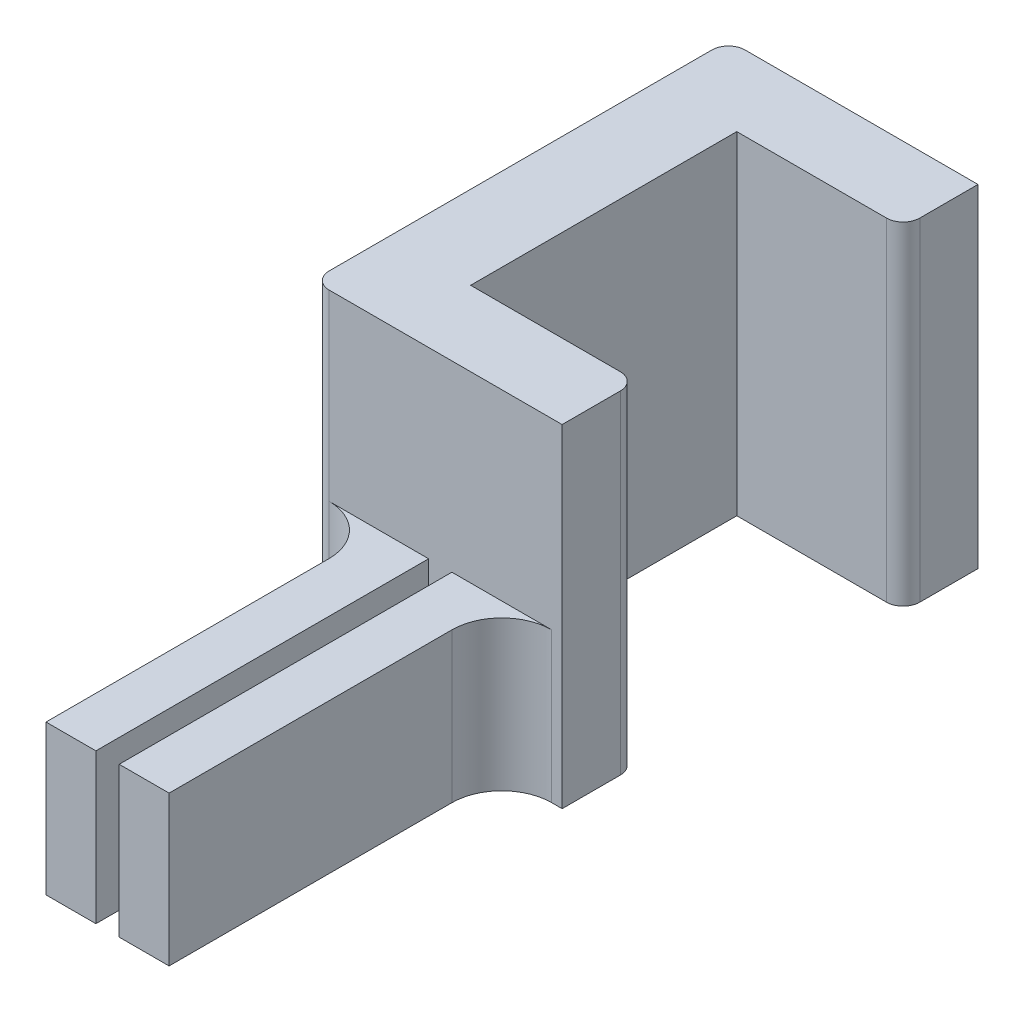
ISO-10303-21;
HEADER;
FILE_DESCRIPTION(('STEP AP214'),'2;1');
FILE_NAME('part.step','',(''),(''),'','','');
FILE_SCHEMA(('AUTOMOTIVE_DESIGN { 1 0 10303 214 1 1 1 1 }'));
ENDSEC;
DATA;
#1=APPLICATION_CONTEXT('core data for automotive mechanical design processes');
#2=APPLICATION_PROTOCOL_DEFINITION('international standard','automotive_design',2000,#1);
#3=PRODUCT_CONTEXT('',#1,'mechanical');
#4=PRODUCT('Part','Part','',(#3));
#5=PRODUCT_RELATED_PRODUCT_CATEGORY('part','',(#4));
#6=PRODUCT_DEFINITION_FORMATION('','',#4);
#7=PRODUCT_DEFINITION_CONTEXT('part definition',#1,'design');
#8=PRODUCT_DEFINITION('design','',#6,#7);
#9=PRODUCT_DEFINITION_SHAPE('','',#8);
#10=(LENGTH_UNIT() NAMED_UNIT(*) SI_UNIT(.MILLI.,.METRE.));
#11=(NAMED_UNIT(*) PLANE_ANGLE_UNIT() SI_UNIT($,.RADIAN.));
#12=(NAMED_UNIT(*) SI_UNIT($,.STERADIAN.) SOLID_ANGLE_UNIT());
#13=UNCERTAINTY_MEASURE_WITH_UNIT(LENGTH_MEASURE(1.E-05),#10,'distance_accuracy_value','');
#14=(GEOMETRIC_REPRESENTATION_CONTEXT(3) GLOBAL_UNCERTAINTY_ASSIGNED_CONTEXT((#13)) GLOBAL_UNIT_ASSIGNED_CONTEXT((#10,
#11,#12)) REPRESENTATION_CONTEXT('',''));
#15=CARTESIAN_POINT('',(0.,0.,0.));
#16=DIRECTION('',(0.,0.,1.));
#17=DIRECTION('',(1.,0.,0.));
#18=AXIS2_PLACEMENT_3D('',#15,#16,#17);
#19=CARTESIAN_POINT('',(15.,20.,0.));
#20=DIRECTION('',(0.,0.,-1.));
#21=DIRECTION('',(-1.,0.,0.));
#22=AXIS2_PLACEMENT_3D('',#19,#20,#21);
#23=PLANE('',#22);
#24=DIRECTION('',(1.,0.,0.));
#25=VECTOR('',#24,1.);
#26=CARTESIAN_POINT('',(15.,20.,0.));
#27=LINE('',#26,#25);
#28=CARTESIAN_POINT('',(1.,20.,0.));
#29=VERTEX_POINT('',#28);
#30=CARTESIAN_POINT('',(15.,20.,0.));
#31=VERTEX_POINT('',#30);
#32=EDGE_CURVE('E255',#29,#31,#27,.T.);
#33=ORIENTED_EDGE('',*,*,#32,.F.);
#34=DIRECTION('',(0.,-1.,0.));
#35=VECTOR('',#34,1.);
#36=CARTESIAN_POINT('',(1.,20.,0.));
#37=LINE('',#36,#35);
#38=CARTESIAN_POINT('',(0.999999508684465,9.,5.65699631983971E-05));
#39=VERTEX_POINT('',#38);
#40=EDGE_CURVE('E11',#29,#39,#37,.T.);
#41=ORIENTED_EDGE('',*,*,#40,.T.);
#42=DIRECTION('',(-1.,0.,0.));
#43=VECTOR('',#42,1.);
#44=CARTESIAN_POINT('',(3.97394471335324,9.,0.));
#45=LINE('',#44,#43);
#46=CARTESIAN_POINT('',(6.97394471335324,9.,0.));
#47=VERTEX_POINT('',#46);
#48=EDGE_CURVE('E337',#47,#39,#45,.T.);
#49=ORIENTED_EDGE('',*,*,#48,.F.);
#50=DIRECTION('',(0.,-1.,0.));
#51=VECTOR('',#50,1.);
#52=CARTESIAN_POINT('',(6.97394471335324,9.,0.));
#53=LINE('',#52,#51);
#54=CARTESIAN_POINT('',(6.97394471335324,0.,0.));
#55=VERTEX_POINT('',#54);
#56=EDGE_CURVE('E225',#47,#55,#53,.T.);
#57=ORIENTED_EDGE('',*,*,#56,.T.);
#58=DIRECTION('',(1.,0.,0.));
#59=VECTOR('',#58,1.);
#60=CARTESIAN_POINT('',(15.,0.,0.));
#61=LINE('',#60,#59);
#62=CARTESIAN_POINT('',(8.37394471335324,0.,0.));
#63=VERTEX_POINT('',#62);
#64=EDGE_CURVE('E223',#55,#63,#61,.T.);
#65=ORIENTED_EDGE('',*,*,#64,.T.);
#66=DIRECTION('',(0.,-1.,0.));
#67=VECTOR('',#66,1.);
#68=CARTESIAN_POINT('',(8.37394471335324,9.,0.));
#69=LINE('',#68,#67);
#70=CARTESIAN_POINT('',(8.37394471335324,9.,0.));
#71=VERTEX_POINT('',#70);
#72=EDGE_CURVE('E232',#71,#63,#69,.T.);
#73=ORIENTED_EDGE('',*,*,#72,.F.);
#74=DIRECTION('',(-1.,0.,0.));
#75=VECTOR('',#74,1.);
#76=CARTESIAN_POINT('',(8.37394471335324,9.,0.));
#77=LINE('',#76,#75);
#78=CARTESIAN_POINT('',(14.3739447133532,9.,0.));
#79=VERTEX_POINT('',#78);
#80=EDGE_CURVE('E248',#79,#71,#77,.T.);
#81=ORIENTED_EDGE('',*,*,#80,.F.);
#82=DIRECTION('',(0.,-1.,0.));
#83=VECTOR('',#82,1.);
#84=CARTESIAN_POINT('',(14.3739447133532,0.,0.));
#85=LINE('',#84,#83);
#86=CARTESIAN_POINT('',(14.3739447133532,0.,0.));
#87=VERTEX_POINT('',#86);
#88=EDGE_CURVE('E305',#79,#87,#85,.T.);
#89=ORIENTED_EDGE('',*,*,#88,.T.);
#90=CARTESIAN_POINT('',(15.,0.,0.));
#91=VERTEX_POINT('',#90);
#92=EDGE_CURVE('E221',#87,#91,#61,.T.);
#93=ORIENTED_EDGE('',*,*,#92,.T.);
#94=DIRECTION('',(0.,-1.,0.));
#95=VECTOR('',#94,1.);
#96=CARTESIAN_POINT('',(15.,20.,0.));
#97=LINE('',#96,#95);
#98=EDGE_CURVE('E301',#31,#91,#97,.T.);
#99=ORIENTED_EDGE('',*,*,#98,.F.);
#100=EDGE_LOOP('',(#33,#41,#49,#57,#65,#73,#81,#89,#93,#99));
#101=FACE_BOUND('',#100,.T.);
#102=ADVANCED_FACE('F39',(#101),#23,.F.);
#103=CARTESIAN_POINT('',(15.,20.,-4.5));
#104=DIRECTION('',(-1.,0.,0.));
#105=DIRECTION('',(0.,0.,1.));
#106=AXIS2_PLACEMENT_3D('',#103,#104,#105);
#107=PLANE('',#106);
#108=DIRECTION('',(0.,0.,-1.));
#109=VECTOR('',#108,1.);
#110=CARTESIAN_POINT('',(15.,0.,-4.5));
#111=LINE('',#110,#109);
#112=CARTESIAN_POINT('',(15.,0.,-3.5));
#113=VERTEX_POINT('',#112);
#114=EDGE_CURVE('E276',#91,#113,#111,.T.);
#115=ORIENTED_EDGE('',*,*,#114,.T.);
#116=DIRECTION('',(0.,-1.,0.));
#117=VECTOR('',#116,1.);
#118=CARTESIAN_POINT('',(15.,20.,-3.5));
#119=LINE('',#118,#117);
#120=CARTESIAN_POINT('',(15.,20.,-3.5));
#121=VERTEX_POINT('',#120);
#122=EDGE_CURVE('E434',#113,#121,#119,.F.);
#123=ORIENTED_EDGE('',*,*,#122,.T.);
#124=DIRECTION('',(0.,0.,-1.));
#125=VECTOR('',#124,1.);
#126=CARTESIAN_POINT('',(15.,20.,-4.5));
#127=LINE('',#126,#125);
#128=EDGE_CURVE('E257',#31,#121,#127,.T.);
#129=ORIENTED_EDGE('',*,*,#128,.F.);
#130=ORIENTED_EDGE('',*,*,#98,.T.);
#131=EDGE_LOOP('',(#115,#123,#129,#130));
#132=FACE_BOUND('',#131,.T.);
#133=ADVANCED_FACE('F390',(#132),#107,.F.);
#134=CARTESIAN_POINT('',(5.,20.,-4.5));
#135=DIRECTION('',(0.,0.,1.));
#136=DIRECTION('',(1.,0.,0.));
#137=AXIS2_PLACEMENT_3D('',#134,#135,#136);
#138=PLANE('',#137);
#139=DIRECTION('',(-1.,0.,0.));
#140=VECTOR('',#139,1.);
#141=CARTESIAN_POINT('',(5.,20.,-4.5));
#142=LINE('',#141,#140);
#143=CARTESIAN_POINT('',(14.,20.,-4.5));
#144=VERTEX_POINT('',#143);
#145=CARTESIAN_POINT('',(5.,20.,-4.5));
#146=VERTEX_POINT('',#145);
#147=EDGE_CURVE('E261',#144,#146,#142,.T.);
#148=ORIENTED_EDGE('',*,*,#147,.F.);
#149=DIRECTION('',(0.,-1.,0.));
#150=VECTOR('',#149,1.);
#151=CARTESIAN_POINT('',(14.,20.,-4.5));
#152=LINE('',#151,#150);
#153=CARTESIAN_POINT('',(14.,0.,-4.5));
#154=VERTEX_POINT('',#153);
#155=EDGE_CURVE('E468',#144,#154,#152,.T.);
#156=ORIENTED_EDGE('',*,*,#155,.T.);
#157=DIRECTION('',(-1.,0.,0.));
#158=VECTOR('',#157,1.);
#159=CARTESIAN_POINT('',(5.,0.,-4.5));
#160=LINE('',#159,#158);
#161=CARTESIAN_POINT('',(5.,0.,-4.5));
#162=VERTEX_POINT('',#161);
#163=EDGE_CURVE('E279',#154,#162,#160,.T.);
#164=ORIENTED_EDGE('',*,*,#163,.T.);
#165=DIRECTION('',(0.,-1.,0.));
#166=VECTOR('',#165,1.);
#167=CARTESIAN_POINT('',(5.,20.,-4.5));
#168=LINE('',#167,#166);
#169=EDGE_CURVE('E298',#146,#162,#168,.T.);
#170=ORIENTED_EDGE('',*,*,#169,.F.);
#171=EDGE_LOOP('',(#148,#156,#164,#170));
#172=FACE_BOUND('',#171,.T.);
#173=ADVANCED_FACE('F397',(#172),#138,.F.);
#174=CARTESIAN_POINT('',(5.,20.,-20.5));
#175=DIRECTION('',(-1.,0.,0.));
#176=DIRECTION('',(0.,0.,1.));
#177=AXIS2_PLACEMENT_3D('',#174,#175,#176);
#178=PLANE('',#177);
#179=DIRECTION('',(0.,0.,-1.));
#180=VECTOR('',#179,1.);
#181=CARTESIAN_POINT('',(5.,0.,-20.5));
#182=LINE('',#181,#180);
#183=CARTESIAN_POINT('',(5.,0.,-20.5));
#184=VERTEX_POINT('',#183);
#185=EDGE_CURVE('E281',#162,#184,#182,.T.);
#186=ORIENTED_EDGE('',*,*,#185,.T.);
#187=DIRECTION('',(0.,-1.,0.));
#188=VECTOR('',#187,1.);
#189=CARTESIAN_POINT('',(5.,20.,-20.5));
#190=LINE('',#189,#188);
#191=CARTESIAN_POINT('',(5.,20.,-20.5));
#192=VERTEX_POINT('',#191);
#193=EDGE_CURVE('E295',#192,#184,#190,.T.);
#194=ORIENTED_EDGE('',*,*,#193,.F.);
#195=DIRECTION('',(0.,0.,-1.));
#196=VECTOR('',#195,1.);
#197=CARTESIAN_POINT('',(5.,20.,-20.5));
#198=LINE('',#197,#196);
#199=EDGE_CURVE('E263',#146,#192,#198,.T.);
#200=ORIENTED_EDGE('',*,*,#199,.F.);
#201=ORIENTED_EDGE('',*,*,#169,.T.);
#202=EDGE_LOOP('',(#186,#194,#200,#201));
#203=FACE_BOUND('',#202,.T.);
#204=ADVANCED_FACE('F483',(#203),#178,.F.);
#205=CARTESIAN_POINT('',(15.,20.,-20.5));
#206=DIRECTION('',(0.,0.,-1.));
#207=DIRECTION('',(-1.,0.,0.));
#208=AXIS2_PLACEMENT_3D('',#205,#206,#207);
#209=PLANE('',#208);
#210=DIRECTION('',(1.,0.,0.));
#211=VECTOR('',#210,1.);
#212=CARTESIAN_POINT('',(15.,0.,-20.5));
#213=LINE('',#212,#211);
#214=CARTESIAN_POINT('',(14.,0.,-20.5));
#215=VERTEX_POINT('',#214);
#216=EDGE_CURVE('E283',#184,#215,#213,.T.);
#217=ORIENTED_EDGE('',*,*,#216,.T.);
#218=DIRECTION('',(0.,-1.,0.));
#219=VECTOR('',#218,1.);
#220=CARTESIAN_POINT('',(14.,20.,-20.5));
#221=LINE('',#220,#219);
#222=CARTESIAN_POINT('',(14.,20.,-20.5));
#223=VERTEX_POINT('',#222);
#224=EDGE_CURVE('E460',#215,#223,#221,.F.);
#225=ORIENTED_EDGE('',*,*,#224,.T.);
#226=DIRECTION('',(1.,0.,0.));
#227=VECTOR('',#226,1.);
#228=CARTESIAN_POINT('',(15.,20.,-20.5));
#229=LINE('',#228,#227);
#230=EDGE_CURVE('E265',#192,#223,#229,.T.);
#231=ORIENTED_EDGE('',*,*,#230,.F.);
#232=ORIENTED_EDGE('',*,*,#193,.T.);
#233=EDGE_LOOP('',(#217,#225,#231,#232));
#234=FACE_BOUND('',#233,.T.);
#235=ADVANCED_FACE('F487',(#234),#209,.F.);
#236=CARTESIAN_POINT('',(15.,20.,-25.));
#237=DIRECTION('',(-1.,0.,0.));
#238=DIRECTION('',(0.,0.,1.));
#239=AXIS2_PLACEMENT_3D('',#236,#237,#238);
#240=PLANE('',#239);
#241=DIRECTION('',(0.,0.,-1.));
#242=VECTOR('',#241,1.);
#243=CARTESIAN_POINT('',(15.,20.,-25.));
#244=LINE('',#243,#242);
#245=CARTESIAN_POINT('',(15.,20.,-21.5));
#246=VERTEX_POINT('',#245);
#247=CARTESIAN_POINT('',(15.,20.,-25.));
#248=VERTEX_POINT('',#247);
#249=EDGE_CURVE('E268',#246,#248,#244,.T.);
#250=ORIENTED_EDGE('',*,*,#249,.F.);
#251=DIRECTION('',(0.,-1.,0.));
#252=VECTOR('',#251,1.);
#253=CARTESIAN_POINT('',(15.,20.,-21.5));
#254=LINE('',#253,#252);
#255=CARTESIAN_POINT('',(15.,0.,-21.5));
#256=VERTEX_POINT('',#255);
#257=EDGE_CURVE('E320',#246,#256,#254,.T.);
#258=ORIENTED_EDGE('',*,*,#257,.T.);
#259=DIRECTION('',(0.,0.,-1.));
#260=VECTOR('',#259,1.);
#261=CARTESIAN_POINT('',(15.,0.,-25.));
#262=LINE('',#261,#260);
#263=CARTESIAN_POINT('',(15.,0.,-25.));
#264=VERTEX_POINT('',#263);
#265=EDGE_CURVE('E286',#256,#264,#262,.T.);
#266=ORIENTED_EDGE('',*,*,#265,.T.);
#267=DIRECTION('',(0.,-1.,0.));
#268=VECTOR('',#267,1.);
#269=CARTESIAN_POINT('',(15.,20.,-25.));
#270=LINE('',#269,#268);
#271=EDGE_CURVE('E274',#248,#264,#270,.T.);
#272=ORIENTED_EDGE('',*,*,#271,.F.);
#273=EDGE_LOOP('',(#250,#258,#266,#272));
#274=FACE_BOUND('',#273,.T.);
#275=ADVANCED_FACE('F454',(#274),#240,.F.);
#276=CARTESIAN_POINT('',(0.,20.,-25.));
#277=DIRECTION('',(0.,0.,1.));
#278=DIRECTION('',(1.,0.,0.));
#279=AXIS2_PLACEMENT_3D('',#276,#277,#278);
#280=PLANE('',#279);
#281=DIRECTION('',(-1.,0.,0.));
#282=VECTOR('',#281,1.);
#283=CARTESIAN_POINT('',(0.,0.,-25.));
#284=LINE('',#283,#282);
#285=CARTESIAN_POINT('',(1.,0.,-25.));
#286=VERTEX_POINT('',#285);
#287=EDGE_CURVE('E288',#264,#286,#284,.T.);
#288=ORIENTED_EDGE('',*,*,#287,.T.);
#289=DIRECTION('',(0.,-1.,0.));
#290=VECTOR('',#289,1.);
#291=CARTESIAN_POINT('',(1.,20.,-25.));
#292=LINE('',#291,#290);
#293=CARTESIAN_POINT('',(1.,20.,-25.));
#294=VERTEX_POINT('',#293);
#295=EDGE_CURVE('E439',#286,#294,#292,.F.);
#296=ORIENTED_EDGE('',*,*,#295,.T.);
#297=DIRECTION('',(-1.,0.,0.));
#298=VECTOR('',#297,1.);
#299=CARTESIAN_POINT('',(0.,20.,-25.));
#300=LINE('',#299,#298);
#301=EDGE_CURVE('E270',#248,#294,#300,.T.);
#302=ORIENTED_EDGE('',*,*,#301,.F.);
#303=ORIENTED_EDGE('',*,*,#271,.T.);
#304=EDGE_LOOP('',(#288,#296,#302,#303));
#305=FACE_BOUND('',#304,.T.);
#306=ADVANCED_FACE('F445',(#305),#280,.F.);
#307=CARTESIAN_POINT('',(0.,20.,0.));
#308=DIRECTION('',(1.,0.,0.));
#309=DIRECTION('',(0.,0.,-1.));
#310=AXIS2_PLACEMENT_3D('',#307,#308,#309);
#311=PLANE('',#310);
#312=DIRECTION('',(0.,0.,1.));
#313=VECTOR('',#312,1.);
#314=CARTESIAN_POINT('',(0.,20.,0.));
#315=LINE('',#314,#313);
#316=CARTESIAN_POINT('',(0.,20.,-24.));
#317=VERTEX_POINT('',#316);
#318=CARTESIAN_POINT('',(0.,20.,-1.));
#319=VERTEX_POINT('',#318);
#320=EDGE_CURVE('E273',#317,#319,#315,.T.);
#321=ORIENTED_EDGE('',*,*,#320,.F.);
#322=DIRECTION('',(0.,-1.,0.));
#323=VECTOR('',#322,1.);
#324=CARTESIAN_POINT('',(0.,20.,-24.));
#325=LINE('',#324,#323);
#326=CARTESIAN_POINT('',(0.,0.,-24.));
#327=VERTEX_POINT('',#326);
#328=EDGE_CURVE('E329',#317,#327,#325,.T.);
#329=ORIENTED_EDGE('',*,*,#328,.T.);
#330=DIRECTION('',(0.,0.,1.));
#331=VECTOR('',#330,1.);
#332=CARTESIAN_POINT('',(0.,0.,0.));
#333=LINE('',#332,#331);
#334=CARTESIAN_POINT('',(0.,0.,-1.));
#335=VERTEX_POINT('',#334);
#336=EDGE_CURVE('E258',#327,#335,#333,.T.);
#337=ORIENTED_EDGE('',*,*,#336,.T.);
#338=DIRECTION('',(0.,-1.,0.));
#339=VECTOR('',#338,1.);
#340=CARTESIAN_POINT('',(0.,20.,-1.));
#341=LINE('',#340,#339);
#342=EDGE_CURVE('E424',#335,#319,#341,.F.);
#343=ORIENTED_EDGE('',*,*,#342,.T.);
#344=EDGE_LOOP('',(#321,#329,#337,#343));
#345=FACE_BOUND('',#344,.T.);
#346=ADVANCED_FACE('F429',(#345),#311,.F.);
#347=CARTESIAN_POINT('',(0.,20.,0.));
#348=DIRECTION('',(0.,-1.,0.));
#349=DIRECTION('',(0.,0.,-1.));
#350=AXIS2_PLACEMENT_3D('',#347,#348,#349);
#351=PLANE('',#350);
#352=ORIENTED_EDGE('',*,*,#301,.T.);
#353=CARTESIAN_POINT('',(1.,20.,-24.));
#354=DIRECTION('',(0.,-1.,0.));
#355=DIRECTION('',(0.,0.,-1.));
#356=AXIS2_PLACEMENT_3D('',#353,#354,#355);
#357=CIRCLE('',#356,1.);
#358=EDGE_CURVE('E51',#294,#317,#357,.F.);
#359=ORIENTED_EDGE('',*,*,#358,.T.);
#360=ORIENTED_EDGE('',*,*,#320,.T.);
#361=CARTESIAN_POINT('',(1.,20.,-1.));
#362=DIRECTION('',(0.,-1.,0.));
#363=DIRECTION('',(0.,0.,-1.));
#364=AXIS2_PLACEMENT_3D('',#361,#362,#363);
#365=CIRCLE('',#364,1.);
#366=EDGE_CURVE('E68',#319,#29,#365,.F.);
#367=ORIENTED_EDGE('',*,*,#366,.T.);
#368=ORIENTED_EDGE('',*,*,#32,.T.);
#369=ORIENTED_EDGE('',*,*,#128,.T.);
#370=CARTESIAN_POINT('',(14.,20.,-3.5));
#371=DIRECTION('',(0.,-1.,0.));
#372=DIRECTION('',(0.,0.,-1.));
#373=AXIS2_PLACEMENT_3D('',#370,#371,#372);
#374=CIRCLE('',#373,1.);
#375=EDGE_CURVE('E464',#121,#144,#374,.F.);
#376=ORIENTED_EDGE('',*,*,#375,.T.);
#377=ORIENTED_EDGE('',*,*,#147,.T.);
#378=ORIENTED_EDGE('',*,*,#199,.T.);
#379=ORIENTED_EDGE('',*,*,#230,.T.);
#380=CARTESIAN_POINT('',(14.,20.,-21.5));
#381=DIRECTION('',(0.,-1.,0.));
#382=DIRECTION('',(0.,0.,-1.));
#383=AXIS2_PLACEMENT_3D('',#380,#381,#382);
#384=CIRCLE('',#383,1.);
#385=EDGE_CURVE('E466',#223,#246,#384,.F.);
#386=ORIENTED_EDGE('',*,*,#385,.T.);
#387=ORIENTED_EDGE('',*,*,#249,.T.);
#388=EDGE_LOOP('',(#352,#359,#360,#367,#368,#369,#376,#377,#378,#379,#386,#387));
#389=FACE_BOUND('',#388,.T.);
#390=ADVANCED_FACE('F440',(#389),#351,.F.);
#391=CARTESIAN_POINT('',(0.,0.,0.));
#392=DIRECTION('',(0.,-1.,0.));
#393=DIRECTION('',(0.,0.,-1.));
#394=AXIS2_PLACEMENT_3D('',#391,#392,#393);
#395=PLANE('',#394);
#396=CARTESIAN_POINT('',(0.973944713353245,0.,3.));
#397=DIRECTION('',(0.,-1.,0.));
#398=DIRECTION('',(0.,0.,-1.));
#399=AXIS2_PLACEMENT_3D('',#396,#397,#398);
#400=CIRCLE('',#399,3.);
#401=CARTESIAN_POINT('',(3.97394471335325,0.,3.));
#402=VERTEX_POINT('',#401);
#403=CARTESIAN_POINT('',(0.973953553032655,0.,-0.000339266250605873));
#404=VERTEX_POINT('',#403);
#405=EDGE_CURVE('E317',#402,#404,#400,.F.);
#406=ORIENTED_EDGE('',*,*,#405,.T.);
#407=CARTESIAN_POINT('',(1.,0.,-1.));
#408=DIRECTION('',(0.,-1.,0.));
#409=DIRECTION('',(0.,0.,-1.));
#410=AXIS2_PLACEMENT_3D('',#407,#408,#409);
#411=CIRCLE('',#410,1.);
#412=EDGE_CURVE('E326',#404,#335,#411,.T.);
#413=ORIENTED_EDGE('',*,*,#412,.T.);
#414=ORIENTED_EDGE('',*,*,#336,.F.);
#415=CARTESIAN_POINT('',(1.,0.,-24.));
#416=DIRECTION('',(0.,-1.,0.));
#417=DIRECTION('',(0.,0.,-1.));
#418=AXIS2_PLACEMENT_3D('',#415,#416,#417);
#419=CIRCLE('',#418,1.);
#420=EDGE_CURVE('E328',#327,#286,#419,.T.);
#421=ORIENTED_EDGE('',*,*,#420,.T.);
#422=ORIENTED_EDGE('',*,*,#287,.F.);
#423=ORIENTED_EDGE('',*,*,#265,.F.);
#424=CARTESIAN_POINT('',(14.,0.,-21.5));
#425=DIRECTION('',(0.,-1.,0.));
#426=DIRECTION('',(0.,0.,-1.));
#427=AXIS2_PLACEMENT_3D('',#424,#425,#426);
#428=CIRCLE('',#427,1.);
#429=EDGE_CURVE('E450',#256,#215,#428,.T.);
#430=ORIENTED_EDGE('',*,*,#429,.T.);
#431=ORIENTED_EDGE('',*,*,#216,.F.);
#432=ORIENTED_EDGE('',*,*,#185,.F.);
#433=ORIENTED_EDGE('',*,*,#163,.F.);
#434=CARTESIAN_POINT('',(14.,0.,-3.5));
#435=DIRECTION('',(0.,-1.,0.));
#436=DIRECTION('',(0.,0.,-1.));
#437=AXIS2_PLACEMENT_3D('',#434,#435,#436);
#438=CIRCLE('',#437,1.);
#439=EDGE_CURVE('E458',#154,#113,#438,.T.);
#440=ORIENTED_EDGE('',*,*,#439,.T.);
#441=ORIENTED_EDGE('',*,*,#114,.F.);
#442=ORIENTED_EDGE('',*,*,#92,.F.);
#443=CARTESIAN_POINT('',(14.3739447133532,0.,3.));
#444=DIRECTION('',(0.,-1.,0.));
#445=DIRECTION('',(0.,0.,-1.));
#446=AXIS2_PLACEMENT_3D('',#443,#444,#445);
#447=CIRCLE('',#446,3.);
#448=CARTESIAN_POINT('',(11.3739447133532,0.,3.));
#449=VERTEX_POINT('',#448);
#450=EDGE_CURVE('E312',#87,#449,#447,.F.);
#451=ORIENTED_EDGE('',*,*,#450,.T.);
#452=DIRECTION('',(0.,0.,-1.));
#453=VECTOR('',#452,1.);
#454=CARTESIAN_POINT('',(11.3739447133532,0.,0.));
#455=LINE('',#454,#453);
#456=CARTESIAN_POINT('',(11.3739447133532,0.,20.));
#457=VERTEX_POINT('',#456);
#458=EDGE_CURVE('E240',#457,#449,#455,.T.);
#459=ORIENTED_EDGE('',*,*,#458,.F.);
#460=DIRECTION('',(1.,0.,0.));
#461=VECTOR('',#460,1.);
#462=CARTESIAN_POINT('',(8.37394471335324,0.,20.));
#463=LINE('',#462,#461);
#464=CARTESIAN_POINT('',(8.37394471335324,0.,20.));
#465=VERTEX_POINT('',#464);
#466=EDGE_CURVE('E244',#465,#457,#463,.T.);
#467=ORIENTED_EDGE('',*,*,#466,.F.);
#468=DIRECTION('',(0.,0.,1.));
#469=VECTOR('',#468,1.);
#470=CARTESIAN_POINT('',(8.37394471335324,0.,20.));
#471=LINE('',#470,#469);
#472=EDGE_CURVE('E238',#63,#465,#471,.T.);
#473=ORIENTED_EDGE('',*,*,#472,.F.);
#474=ORIENTED_EDGE('',*,*,#64,.F.);
#475=DIRECTION('',(0.,0.,-1.));
#476=VECTOR('',#475,1.);
#477=CARTESIAN_POINT('',(6.97394471335324,0.,20.));
#478=LINE('',#477,#476);
#479=CARTESIAN_POINT('',(6.97394471335324,0.,20.));
#480=VERTEX_POINT('',#479);
#481=EDGE_CURVE('E206',#480,#55,#478,.T.);
#482=ORIENTED_EDGE('',*,*,#481,.F.);
#483=DIRECTION('',(1.,0.,0.));
#484=VECTOR('',#483,1.);
#485=CARTESIAN_POINT('',(3.97394471335325,0.,20.));
#486=LINE('',#485,#484);
#487=CARTESIAN_POINT('',(3.97394471335325,0.,20.));
#488=VERTEX_POINT('',#487);
#489=EDGE_CURVE('E345',#488,#480,#486,.T.);
#490=ORIENTED_EDGE('',*,*,#489,.F.);
#491=DIRECTION('',(0.,0.,1.));
#492=VECTOR('',#491,1.);
#493=CARTESIAN_POINT('',(3.97394471335324,0.,0.));
#494=LINE('',#493,#492);
#495=EDGE_CURVE('E219',#402,#488,#494,.T.);
#496=ORIENTED_EDGE('',*,*,#495,.F.);
#497=EDGE_LOOP('',(#406,#413,#414,#421,#422,#423,#430,#431,#432,#433,#440,#441,#442,#451,#459,
#467,#473,#474,#482,#490,#496));
#498=FACE_BOUND('',#497,.T.);
#499=ADVANCED_FACE('F358',(#498),#395,.T.);
#500=CARTESIAN_POINT('',(8.37394471335324,9.,20.));
#501=DIRECTION('',(0.,0.,-1.));
#502=DIRECTION('',(-1.,0.,0.));
#503=AXIS2_PLACEMENT_3D('',#500,#501,#502);
#504=PLANE('',#503);
#505=ORIENTED_EDGE('',*,*,#466,.T.);
#506=DIRECTION('',(0.,-1.,0.));
#507=VECTOR('',#506,1.);
#508=CARTESIAN_POINT('',(11.3739447133532,9.,20.));
#509=LINE('',#508,#507);
#510=CARTESIAN_POINT('',(11.3739447133532,9.,20.));
#511=VERTEX_POINT('',#510);
#512=EDGE_CURVE('E229',#511,#457,#509,.T.);
#513=ORIENTED_EDGE('',*,*,#512,.F.);
#514=DIRECTION('',(1.,0.,0.));
#515=VECTOR('',#514,1.);
#516=CARTESIAN_POINT('',(8.37394471335324,9.,20.));
#517=LINE('',#516,#515);
#518=CARTESIAN_POINT('',(8.37394471335324,9.,20.));
#519=VERTEX_POINT('',#518);
#520=EDGE_CURVE('E241',#519,#511,#517,.T.);
#521=ORIENTED_EDGE('',*,*,#520,.F.);
#522=DIRECTION('',(0.,-1.,0.));
#523=VECTOR('',#522,1.);
#524=CARTESIAN_POINT('',(8.37394471335324,9.,20.));
#525=LINE('',#524,#523);
#526=EDGE_CURVE('E234',#519,#465,#525,.T.);
#527=ORIENTED_EDGE('',*,*,#526,.T.);
#528=EDGE_LOOP('',(#505,#513,#521,#527));
#529=FACE_BOUND('',#528,.T.);
#530=ADVANCED_FACE('F366',(#529),#504,.F.);
#531=CARTESIAN_POINT('',(11.3739447133532,9.,0.));
#532=DIRECTION('',(-1.,0.,0.));
#533=DIRECTION('',(0.,0.,1.));
#534=AXIS2_PLACEMENT_3D('',#531,#532,#533);
#535=PLANE('',#534);
#536=ORIENTED_EDGE('',*,*,#458,.T.);
#537=DIRECTION('',(0.,-1.,0.));
#538=VECTOR('',#537,1.);
#539=CARTESIAN_POINT('',(11.3739447133532,9.,3.));
#540=LINE('',#539,#538);
#541=CARTESIAN_POINT('',(11.3739447133532,9.,3.));
#542=VERTEX_POINT('',#541);
#543=EDGE_CURVE('E308',#449,#542,#540,.F.);
#544=ORIENTED_EDGE('',*,*,#543,.T.);
#545=DIRECTION('',(0.,0.,-1.));
#546=VECTOR('',#545,1.);
#547=CARTESIAN_POINT('',(11.3739447133532,9.,0.));
#548=LINE('',#547,#546);
#549=EDGE_CURVE('E250',#511,#542,#548,.T.);
#550=ORIENTED_EDGE('',*,*,#549,.F.);
#551=ORIENTED_EDGE('',*,*,#512,.T.);
#552=EDGE_LOOP('',(#536,#544,#550,#551));
#553=FACE_BOUND('',#552,.T.);
#554=ADVANCED_FACE('F378',(#553),#535,.F.);
#555=CARTESIAN_POINT('',(8.37394471335324,9.,20.));
#556=DIRECTION('',(1.,0.,0.));
#557=DIRECTION('',(0.,0.,-1.));
#558=AXIS2_PLACEMENT_3D('',#555,#556,#557);
#559=PLANE('',#558);
#560=ORIENTED_EDGE('',*,*,#472,.T.);
#561=ORIENTED_EDGE('',*,*,#526,.F.);
#562=DIRECTION('',(0.,0.,1.));
#563=VECTOR('',#562,1.);
#564=CARTESIAN_POINT('',(8.37394471335324,9.,20.));
#565=LINE('',#564,#563);
#566=EDGE_CURVE('E237',#71,#519,#565,.T.);
#567=ORIENTED_EDGE('',*,*,#566,.F.);
#568=ORIENTED_EDGE('',*,*,#72,.T.);
#569=EDGE_LOOP('',(#560,#561,#567,#568));
#570=FACE_BOUND('',#569,.T.);
#571=ADVANCED_FACE('F362',(#570),#559,.F.);
#572=CARTESIAN_POINT('',(0.,9.,0.));
#573=DIRECTION('',(0.,-1.,0.));
#574=DIRECTION('',(0.,0.,-1.));
#575=AXIS2_PLACEMENT_3D('',#572,#573,#574);
#576=PLANE('',#575);
#577=ORIENTED_EDGE('',*,*,#520,.T.);
#578=ORIENTED_EDGE('',*,*,#549,.T.);
#579=CARTESIAN_POINT('',(14.3739447133532,9.,3.));
#580=DIRECTION('',(0.,-1.,0.));
#581=DIRECTION('',(0.,0.,-1.));
#582=AXIS2_PLACEMENT_3D('',#579,#580,#581);
#583=CIRCLE('',#582,3.);
#584=EDGE_CURVE('E314',#542,#79,#583,.T.);
#585=ORIENTED_EDGE('',*,*,#584,.T.);
#586=ORIENTED_EDGE('',*,*,#80,.T.);
#587=ORIENTED_EDGE('',*,*,#566,.T.);
#588=EDGE_LOOP('',(#577,#578,#585,#586,#587));
#589=FACE_BOUND('',#588,.T.);
#590=ADVANCED_FACE('F369',(#589),#576,.F.);
#591=CARTESIAN_POINT('',(3.97394471335324,9.,0.));
#592=DIRECTION('',(1.,0.,0.));
#593=DIRECTION('',(0.,0.,-1.));
#594=AXIS2_PLACEMENT_3D('',#591,#592,#593);
#595=PLANE('',#594);
#596=DIRECTION('',(0.,0.,1.));
#597=VECTOR('',#596,1.);
#598=CARTESIAN_POINT('',(3.97394471335324,9.,0.));
#599=LINE('',#598,#597);
#600=CARTESIAN_POINT('',(3.97394471335325,9.,3.));
#601=VERTEX_POINT('',#600);
#602=CARTESIAN_POINT('',(3.97394471335325,9.,20.));
#603=VERTEX_POINT('',#602);
#604=EDGE_CURVE('E195',#601,#603,#599,.T.);
#605=ORIENTED_EDGE('',*,*,#604,.F.);
#606=DIRECTION('',(0.,-1.,0.));
#607=VECTOR('',#606,1.);
#608=CARTESIAN_POINT('',(3.97394471335325,0.,3.));
#609=LINE('',#608,#607);
#610=EDGE_CURVE('E310',#601,#402,#609,.T.);
#611=ORIENTED_EDGE('',*,*,#610,.T.);
#612=ORIENTED_EDGE('',*,*,#495,.T.);
#613=DIRECTION('',(0.,-1.,0.));
#614=VECTOR('',#613,1.);
#615=CARTESIAN_POINT('',(3.97394471335325,9.,20.));
#616=LINE('',#615,#614);
#617=EDGE_CURVE('E211',#603,#488,#616,.T.);
#618=ORIENTED_EDGE('',*,*,#617,.F.);
#619=EDGE_LOOP('',(#605,#611,#612,#618));
#620=FACE_BOUND('',#619,.T.);
#621=ADVANCED_FACE('F217',(#620),#595,.F.);
#622=CARTESIAN_POINT('',(3.97394471335325,9.,20.));
#623=DIRECTION('',(0.,0.,-1.));
#624=DIRECTION('',(-1.,0.,0.));
#625=AXIS2_PLACEMENT_3D('',#622,#623,#624);
#626=PLANE('',#625);
#627=ORIENTED_EDGE('',*,*,#489,.T.);
#628=DIRECTION('',(0.,-1.,0.));
#629=VECTOR('',#628,1.);
#630=CARTESIAN_POINT('',(6.97394471335324,9.,20.));
#631=LINE('',#630,#629);
#632=CARTESIAN_POINT('',(6.97394471335324,9.,20.));
#633=VERTEX_POINT('',#632);
#634=EDGE_CURVE('E213',#633,#480,#631,.T.);
#635=ORIENTED_EDGE('',*,*,#634,.F.);
#636=DIRECTION('',(1.,0.,0.));
#637=VECTOR('',#636,1.);
#638=CARTESIAN_POINT('',(3.97394471335325,9.,20.));
#639=LINE('',#638,#637);
#640=EDGE_CURVE('E199',#603,#633,#639,.T.);
#641=ORIENTED_EDGE('',*,*,#640,.F.);
#642=ORIENTED_EDGE('',*,*,#617,.T.);
#643=EDGE_LOOP('',(#627,#635,#641,#642));
#644=FACE_BOUND('',#643,.T.);
#645=ADVANCED_FACE('F210',(#644),#626,.F.);
#646=CARTESIAN_POINT('',(6.97394471335324,9.,20.));
#647=DIRECTION('',(-1.,0.,0.));
#648=DIRECTION('',(0.,0.,1.));
#649=AXIS2_PLACEMENT_3D('',#646,#647,#648);
#650=PLANE('',#649);
#651=ORIENTED_EDGE('',*,*,#481,.T.);
#652=ORIENTED_EDGE('',*,*,#56,.F.);
#653=DIRECTION('',(0.,0.,-1.));
#654=VECTOR('',#653,1.);
#655=CARTESIAN_POINT('',(6.97394471335324,9.,20.));
#656=LINE('',#655,#654);
#657=EDGE_CURVE('E215',#633,#47,#656,.T.);
#658=ORIENTED_EDGE('',*,*,#657,.F.);
#659=ORIENTED_EDGE('',*,*,#634,.T.);
#660=EDGE_LOOP('',(#651,#652,#658,#659));
#661=FACE_BOUND('',#660,.T.);
#662=ADVANCED_FACE('F536',(#661),#650,.F.);
#663=CARTESIAN_POINT('',(0.,9.,0.));
#664=DIRECTION('',(0.,1.,0.));
#665=DIRECTION('',(0.,0.,1.));
#666=AXIS2_PLACEMENT_3D('',#663,#664,#665);
#667=PLANE('',#666);
#668=ORIENTED_EDGE('',*,*,#48,.T.);
#669=CARTESIAN_POINT('',(0.973944713353245,9.,3.));
#670=DIRECTION('',(0.,1.,0.));
#671=DIRECTION('',(0.,0.,1.));
#672=AXIS2_PLACEMENT_3D('',#669,#670,#671);
#673=CIRCLE('',#672,3.);
#674=EDGE_CURVE('E201',#39,#601,#673,.F.);
#675=ORIENTED_EDGE('',*,*,#674,.T.);
#676=ORIENTED_EDGE('',*,*,#604,.T.);
#677=ORIENTED_EDGE('',*,*,#640,.T.);
#678=ORIENTED_EDGE('',*,*,#657,.T.);
#679=EDGE_LOOP('',(#668,#675,#676,#677,#678));
#680=FACE_BOUND('',#679,.T.);
#681=ADVANCED_FACE('F198',(#680),#667,.T.);
#682=CARTESIAN_POINT('',(14.3739447133532,20.,3.));
#683=DIRECTION('',(0.,1.,0.));
#684=DIRECTION('',(0.,0.,1.));
#685=AXIS2_PLACEMENT_3D('',#682,#683,#684);
#686=CYLINDRICAL_SURFACE('',#685,3.);
#687=ORIENTED_EDGE('',*,*,#584,.F.);
#688=ORIENTED_EDGE('',*,*,#543,.F.);
#689=ORIENTED_EDGE('',*,*,#450,.F.);
#690=ORIENTED_EDGE('',*,*,#88,.F.);
#691=EDGE_LOOP('',(#687,#688,#689,#690));
#692=FACE_BOUND('',#691,.T.);
#693=ADVANCED_FACE('F375',(#692),#686,.F.);
#694=CARTESIAN_POINT('',(0.973944713353245,9.,3.));
#695=DIRECTION('',(0.,1.,0.));
#696=DIRECTION('',(0.,0.,1.));
#697=AXIS2_PLACEMENT_3D('',#694,#695,#696);
#698=CYLINDRICAL_SURFACE('',#697,3.);
#699=CARTESIAN_POINT('',(1.,9.,-1.));
#700=DIRECTION('',(0.,1.,0.));
#701=DIRECTION('',(-0.0260464469673465,0.,0.999660733749394));
#702=AXIS2_PLACEMENT_3D('',#699,#700,#701);
#703=CIRCLE('',#702,1.);
#704=CARTESIAN_POINT('',(0.973944713353245,9.,0.));
#705=VERTEX_POINT('',#704);
#706=EDGE_CURVE('E59',#705,#39,#703,.T.);
#707=ORIENTED_EDGE('',*,*,#706,.F.);
#708=CARTESIAN_POINT('',(0.973953553032654,0.,-0.000339266250605789));
#709=DIRECTION('',(0.,1.,0.));
#710=VECTOR('',#709,1.);
#711=LINE('',#708,#710);
#712=EDGE_CURVE('E304',#404,#705,#711,.T.);
#713=ORIENTED_EDGE('',*,*,#712,.F.);
#714=ORIENTED_EDGE('',*,*,#405,.F.);
#715=ORIENTED_EDGE('',*,*,#610,.F.);
#716=ORIENTED_EDGE('',*,*,#674,.F.);
#717=EDGE_LOOP('',(#707,#713,#714,#715,#716));
#718=FACE_BOUND('',#717,.T.);
#719=ADVANCED_FACE('F403',(#718),#698,.F.);
#720=CARTESIAN_POINT('',(14.,20.,-21.5));
#721=DIRECTION('',(0.,-1.,0.));
#722=DIRECTION('',(0.,0.,-1.));
#723=AXIS2_PLACEMENT_3D('',#720,#721,#722);
#724=CYLINDRICAL_SURFACE('',#723,1.);
#725=ORIENTED_EDGE('',*,*,#385,.F.);
#726=ORIENTED_EDGE('',*,*,#224,.F.);
#727=ORIENTED_EDGE('',*,*,#429,.F.);
#728=ORIENTED_EDGE('',*,*,#257,.F.);
#729=EDGE_LOOP('',(#725,#726,#727,#728));
#730=FACE_BOUND('',#729,.T.);
#731=ADVANCED_FACE('F407',(#730),#724,.T.);
#732=CARTESIAN_POINT('',(14.,20.,-3.5));
#733=DIRECTION('',(0.,-1.,0.));
#734=DIRECTION('',(0.,0.,-1.));
#735=AXIS2_PLACEMENT_3D('',#732,#733,#734);
#736=CYLINDRICAL_SURFACE('',#735,1.);
#737=ORIENTED_EDGE('',*,*,#375,.F.);
#738=ORIENTED_EDGE('',*,*,#122,.F.);
#739=ORIENTED_EDGE('',*,*,#439,.F.);
#740=ORIENTED_EDGE('',*,*,#155,.F.);
#741=EDGE_LOOP('',(#737,#738,#739,#740));
#742=FACE_BOUND('',#741,.T.);
#743=ADVANCED_FACE('F477',(#742),#736,.T.);
#744=CARTESIAN_POINT('',(1.,20.,-24.));
#745=DIRECTION('',(0.,-1.,0.));
#746=DIRECTION('',(0.,0.,-1.));
#747=AXIS2_PLACEMENT_3D('',#744,#745,#746);
#748=CYLINDRICAL_SURFACE('',#747,1.);
#749=ORIENTED_EDGE('',*,*,#358,.F.);
#750=ORIENTED_EDGE('',*,*,#295,.F.);
#751=ORIENTED_EDGE('',*,*,#420,.F.);
#752=ORIENTED_EDGE('',*,*,#328,.F.);
#753=EDGE_LOOP('',(#749,#750,#751,#752));
#754=FACE_BOUND('',#753,.T.);
#755=ADVANCED_FACE('F443',(#754),#748,.T.);
#756=CARTESIAN_POINT('',(1.,20.,-1.));
#757=DIRECTION('',(0.,-1.,0.));
#758=DIRECTION('',(0.,0.,-1.));
#759=AXIS2_PLACEMENT_3D('',#756,#757,#758);
#760=CYLINDRICAL_SURFACE('',#759,1.);
#761=ORIENTED_EDGE('',*,*,#366,.F.);
#762=ORIENTED_EDGE('',*,*,#342,.F.);
#763=ORIENTED_EDGE('',*,*,#412,.F.);
#764=ORIENTED_EDGE('',*,*,#712,.T.);
#765=ORIENTED_EDGE('',*,*,#706,.T.);
#766=ORIENTED_EDGE('',*,*,#40,.F.);
#767=EDGE_LOOP('',(#761,#762,#763,#764,#765,#766));
#768=FACE_BOUND('',#767,.T.);
#769=ADVANCED_FACE('F41',(#768),#760,.T.);
#770=CLOSED_SHELL('',(#102,#133,#173,#204,#235,#275,#306,#346,#390,#499,#530,#554,#571,#590,
#621,#645,#662,#681,#693,#719,#731,#743,#755,#769));
#771=MANIFOLD_SOLID_BREP('B2',#770);
#772=ADVANCED_BREP_SHAPE_REPRESENTATION('',(#18,#771),#14);
#773=SHAPE_DEFINITION_REPRESENTATION(#9,#772);
ENDSEC;
END-ISO-10303-21;
